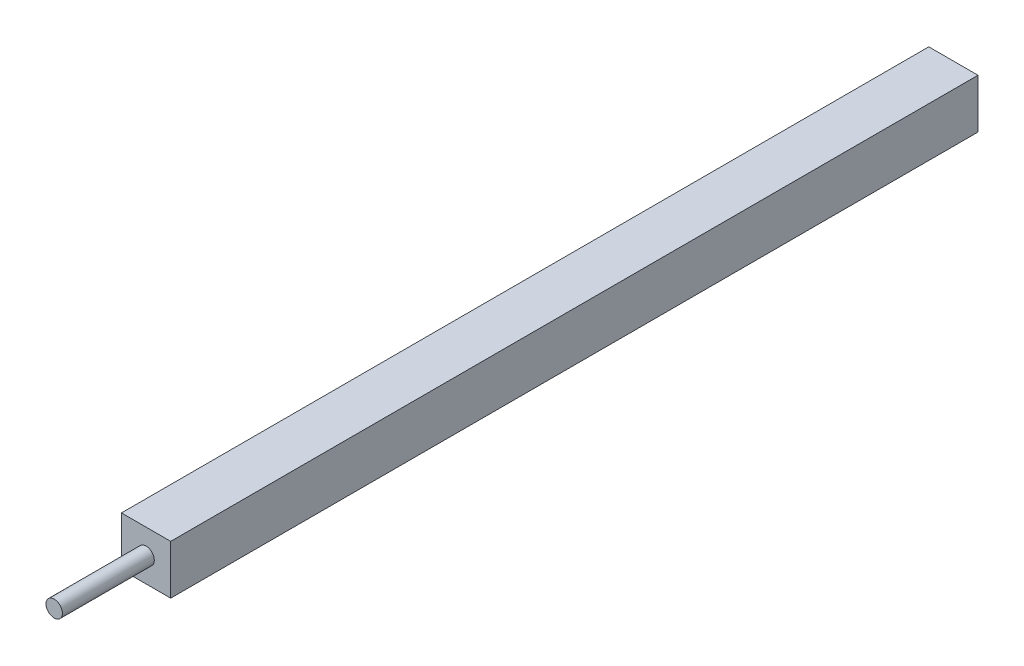
ISO-10303-21;
HEADER;
FILE_DESCRIPTION(('STEP AP214'),'2;1');
FILE_NAME('part.step','',(''),(''),'','','');
FILE_SCHEMA(('AUTOMOTIVE_DESIGN { 1 0 10303 214 1 1 1 1 }'));
ENDSEC;
DATA;
#1=APPLICATION_CONTEXT('core data for automotive mechanical design processes');
#2=APPLICATION_PROTOCOL_DEFINITION('international standard','automotive_design',2000,#1);
#3=PRODUCT_CONTEXT('',#1,'mechanical');
#4=PRODUCT('Part','Part','',(#3));
#5=PRODUCT_RELATED_PRODUCT_CATEGORY('part','',(#4));
#6=PRODUCT_DEFINITION_FORMATION('','',#4);
#7=PRODUCT_DEFINITION_CONTEXT('part definition',#1,'design');
#8=PRODUCT_DEFINITION('design','',#6,#7);
#9=PRODUCT_DEFINITION_SHAPE('','',#8);
#10=(LENGTH_UNIT() NAMED_UNIT(*) SI_UNIT(.MILLI.,.METRE.));
#11=(NAMED_UNIT(*) PLANE_ANGLE_UNIT() SI_UNIT($,.RADIAN.));
#12=(NAMED_UNIT(*) SI_UNIT($,.STERADIAN.) SOLID_ANGLE_UNIT());
#13=UNCERTAINTY_MEASURE_WITH_UNIT(LENGTH_MEASURE(1.E-05),#10,'distance_accuracy_value','');
#14=(GEOMETRIC_REPRESENTATION_CONTEXT(3) GLOBAL_UNCERTAINTY_ASSIGNED_CONTEXT((#13)) GLOBAL_UNIT_ASSIGNED_CONTEXT((#10,
#11,#12)) REPRESENTATION_CONTEXT('',''));
#15=CARTESIAN_POINT('',(0.,0.,0.));
#16=DIRECTION('',(0.,0.,1.));
#17=DIRECTION('',(1.,0.,0.));
#18=AXIS2_PLACEMENT_3D('',#15,#16,#17);
#19=CARTESIAN_POINT('',(0.,0.,246.));
#20=DIRECTION('',(1.,0.,0.));
#21=DIRECTION('',(0.,1.,0.));
#22=AXIS2_PLACEMENT_3D('',#19,#20,#21);
#23=PLANE('',#22);
#24=DIRECTION('',(0.,-1.,0.));
#25=VECTOR('',#24,1.);
#26=CARTESIAN_POINT('',(0.,0.,0.));
#27=LINE('',#26,#25);
#28=CARTESIAN_POINT('',(0.,0.,0.));
#29=VERTEX_POINT('',#28);
#30=CARTESIAN_POINT('',(0.,-15.,0.));
#31=VERTEX_POINT('',#30);
#32=EDGE_CURVE('E114',#29,#31,#27,.T.);
#33=ORIENTED_EDGE('',*,*,#32,.T.);
#34=DIRECTION('',(0.,0.,-1.));
#35=VECTOR('',#34,1.);
#36=CARTESIAN_POINT('',(0.,-15.,246.));
#37=LINE('',#36,#35);
#38=CARTESIAN_POINT('',(0.,-15.,246.));
#39=VERTEX_POINT('',#38);
#40=EDGE_CURVE('E46',#39,#31,#37,.T.);
#41=ORIENTED_EDGE('',*,*,#40,.F.);
#42=DIRECTION('',(0.,-1.,0.));
#43=VECTOR('',#42,1.);
#44=CARTESIAN_POINT('',(0.,0.,246.));
#45=LINE('',#44,#43);
#46=CARTESIAN_POINT('',(0.,0.,246.));
#47=VERTEX_POINT('',#46);
#48=EDGE_CURVE('E97',#47,#39,#45,.T.);
#49=ORIENTED_EDGE('',*,*,#48,.F.);
#50=DIRECTION('',(0.,0.,-1.));
#51=VECTOR('',#50,1.);
#52=CARTESIAN_POINT('',(0.,0.,246.));
#53=LINE('',#52,#51);
#54=EDGE_CURVE('E110',#47,#29,#53,.T.);
#55=ORIENTED_EDGE('',*,*,#54,.T.);
#56=EDGE_LOOP('',(#33,#41,#49,#55));
#57=FACE_BOUND('',#56,.T.);
#58=ADVANCED_FACE('F43',(#57),#23,.F.);
#59=CARTESIAN_POINT('',(0.,-15.,246.));
#60=DIRECTION('',(0.,1.,0.));
#61=DIRECTION('',(0.,0.,1.));
#62=AXIS2_PLACEMENT_3D('',#59,#60,#61);
#63=PLANE('',#62);
#64=DIRECTION('',(1.,0.,0.));
#65=VECTOR('',#64,1.);
#66=CARTESIAN_POINT('',(0.,-15.,0.));
#67=LINE('',#66,#65);
#68=CARTESIAN_POINT('',(15.,-15.,0.));
#69=VERTEX_POINT('',#68);
#70=EDGE_CURVE('E103',#31,#69,#67,.T.);
#71=ORIENTED_EDGE('',*,*,#70,.T.);
#72=DIRECTION('',(0.,0.,-1.));
#73=VECTOR('',#72,1.);
#74=CARTESIAN_POINT('',(15.,-15.,246.));
#75=LINE('',#74,#73);
#76=CARTESIAN_POINT('',(15.,-15.,246.));
#77=VERTEX_POINT('',#76);
#78=EDGE_CURVE('E101',#77,#69,#75,.T.);
#79=ORIENTED_EDGE('',*,*,#78,.F.);
#80=DIRECTION('',(1.,0.,0.));
#81=VECTOR('',#80,1.);
#82=CARTESIAN_POINT('',(0.,-15.,246.));
#83=LINE('',#82,#81);
#84=EDGE_CURVE('E92',#39,#77,#83,.T.);
#85=ORIENTED_EDGE('',*,*,#84,.F.);
#86=ORIENTED_EDGE('',*,*,#40,.T.);
#87=EDGE_LOOP('',(#71,#79,#85,#86));
#88=FACE_BOUND('',#87,.T.);
#89=ADVANCED_FACE('F102',(#88),#63,.F.);
#90=CARTESIAN_POINT('',(15.,0.,246.));
#91=DIRECTION('',(-1.,0.,0.));
#92=DIRECTION('',(0.,-1.,0.));
#93=AXIS2_PLACEMENT_3D('',#90,#91,#92);
#94=PLANE('',#93);
#95=DIRECTION('',(0.,1.,0.));
#96=VECTOR('',#95,1.);
#97=CARTESIAN_POINT('',(15.,0.,0.));
#98=LINE('',#97,#96);
#99=CARTESIAN_POINT('',(15.,0.,0.));
#100=VERTEX_POINT('',#99);
#101=EDGE_CURVE('E78',#69,#100,#98,.T.);
#102=ORIENTED_EDGE('',*,*,#101,.T.);
#103=DIRECTION('',(0.,0.,-1.));
#104=VECTOR('',#103,1.);
#105=CARTESIAN_POINT('',(15.,0.,246.));
#106=LINE('',#105,#104);
#107=CARTESIAN_POINT('',(15.,0.,246.));
#108=VERTEX_POINT('',#107);
#109=EDGE_CURVE('E105',#108,#100,#106,.T.);
#110=ORIENTED_EDGE('',*,*,#109,.F.);
#111=DIRECTION('',(0.,1.,0.));
#112=VECTOR('',#111,1.);
#113=CARTESIAN_POINT('',(15.,0.,246.));
#114=LINE('',#113,#112);
#115=EDGE_CURVE('E95',#77,#108,#114,.T.);
#116=ORIENTED_EDGE('',*,*,#115,.F.);
#117=ORIENTED_EDGE('',*,*,#78,.T.);
#118=EDGE_LOOP('',(#102,#110,#116,#117));
#119=FACE_BOUND('',#118,.T.);
#120=ADVANCED_FACE('F106',(#119),#94,.F.);
#121=CARTESIAN_POINT('',(0.,0.,246.));
#122=DIRECTION('',(0.,-1.,0.));
#123=DIRECTION('',(0.,0.,-1.));
#124=AXIS2_PLACEMENT_3D('',#121,#122,#123);
#125=PLANE('',#124);
#126=DIRECTION('',(-1.,0.,0.));
#127=VECTOR('',#126,1.);
#128=CARTESIAN_POINT('',(0.,0.,0.));
#129=LINE('',#128,#127);
#130=EDGE_CURVE('E84',#100,#29,#129,.T.);
#131=ORIENTED_EDGE('',*,*,#130,.T.);
#132=ORIENTED_EDGE('',*,*,#54,.F.);
#133=DIRECTION('',(-1.,0.,0.));
#134=VECTOR('',#133,1.);
#135=CARTESIAN_POINT('',(0.,0.,246.));
#136=LINE('',#135,#134);
#137=EDGE_CURVE('E61',#108,#47,#136,.T.);
#138=ORIENTED_EDGE('',*,*,#137,.F.);
#139=ORIENTED_EDGE('',*,*,#109,.T.);
#140=EDGE_LOOP('',(#131,#132,#138,#139));
#141=FACE_BOUND('',#140,.T.);
#142=ADVANCED_FACE('F128',(#141),#125,.F.);
#143=CARTESIAN_POINT('',(0.,0.,246.));
#144=DIRECTION('',(0.,0.,1.));
#145=DIRECTION('',(1.,0.,0.));
#146=AXIS2_PLACEMENT_3D('',#143,#144,#145);
#147=PLANE('',#146);
#148=CARTESIAN_POINT('',(7.5,-7.5,246.));
#149=DIRECTION('',(0.,0.,1.));
#150=DIRECTION('',(1.,0.,0.));
#151=AXIS2_PLACEMENT_3D('',#148,#149,#150);
#152=CIRCLE('',#151,2.5);
#153=CARTESIAN_POINT('',(10.,-7.5,246.));
#154=VERTEX_POINT('',#153);
#155=EDGE_CURVE('E11',#154,#154,#152,.T.);
#156=ORIENTED_EDGE('',*,*,#155,.F.);
#157=EDGE_LOOP('',(#156));
#158=FACE_BOUND('',#157,.T.);
#159=ORIENTED_EDGE('',*,*,#48,.T.);
#160=ORIENTED_EDGE('',*,*,#84,.T.);
#161=ORIENTED_EDGE('',*,*,#115,.T.);
#162=ORIENTED_EDGE('',*,*,#137,.T.);
#163=EDGE_LOOP('',(#159,#160,#161,#162));
#164=FACE_BOUND('',#163,.T.);
#165=ADVANCED_FACE('F93',(#158,#164),#147,.T.);
#166=CARTESIAN_POINT('',(0.,0.,0.));
#167=DIRECTION('',(0.,0.,1.));
#168=DIRECTION('',(1.,0.,0.));
#169=AXIS2_PLACEMENT_3D('',#166,#167,#168);
#170=PLANE('',#169);
#171=ORIENTED_EDGE('',*,*,#32,.F.);
#172=ORIENTED_EDGE('',*,*,#130,.F.);
#173=ORIENTED_EDGE('',*,*,#101,.F.);
#174=ORIENTED_EDGE('',*,*,#70,.F.);
#175=EDGE_LOOP('',(#171,#172,#173,#174));
#176=FACE_BOUND('',#175,.T.);
#177=ADVANCED_FACE('F131',(#176),#170,.F.);
#178=CARTESIAN_POINT('',(7.5,-7.5,274.));
#179=DIRECTION('',(0.,0.,-1.));
#180=DIRECTION('',(-1.,0.,0.));
#181=AXIS2_PLACEMENT_3D('',#178,#179,#180);
#182=CYLINDRICAL_SURFACE('',#181,2.5);
#183=CARTESIAN_POINT('',(7.5,-7.5,274.));
#184=DIRECTION('',(0.,0.,1.));
#185=DIRECTION('',(1.,0.,0.));
#186=AXIS2_PLACEMENT_3D('',#183,#184,#185);
#187=CIRCLE('',#186,2.5);
#188=CARTESIAN_POINT('',(10.,-7.5,274.));
#189=VERTEX_POINT('',#188);
#190=EDGE_CURVE('E118',#189,#189,#187,.T.);
#191=ORIENTED_EDGE('',*,*,#190,.F.);
#192=EDGE_LOOP('',(#191));
#193=FACE_BOUND('',#192,.T.);
#194=ORIENTED_EDGE('',*,*,#155,.T.);
#195=EDGE_LOOP('',(#194));
#196=FACE_BOUND('',#195,.T.);
#197=ADVANCED_FACE('F141',(#193,#196),#182,.T.);
#198=CARTESIAN_POINT('',(7.5,-7.5,274.));
#199=DIRECTION('',(0.,0.,1.));
#200=DIRECTION('',(1.,0.,0.));
#201=AXIS2_PLACEMENT_3D('',#198,#199,#200);
#202=PLANE('',#201);
#203=ORIENTED_EDGE('',*,*,#190,.T.);
#204=EDGE_LOOP('',(#203));
#205=FACE_BOUND('',#204,.T.);
#206=ADVANCED_FACE('F139',(#205),#202,.T.);
#207=CLOSED_SHELL('',(#58,#89,#120,#142,#165,#177,#197,#206));
#208=MANIFOLD_SOLID_BREP('B2',#207);
#209=ADVANCED_BREP_SHAPE_REPRESENTATION('',(#18,#208),#14);
#210=SHAPE_DEFINITION_REPRESENTATION(#9,#209);
ENDSEC;
END-ISO-10303-21;
